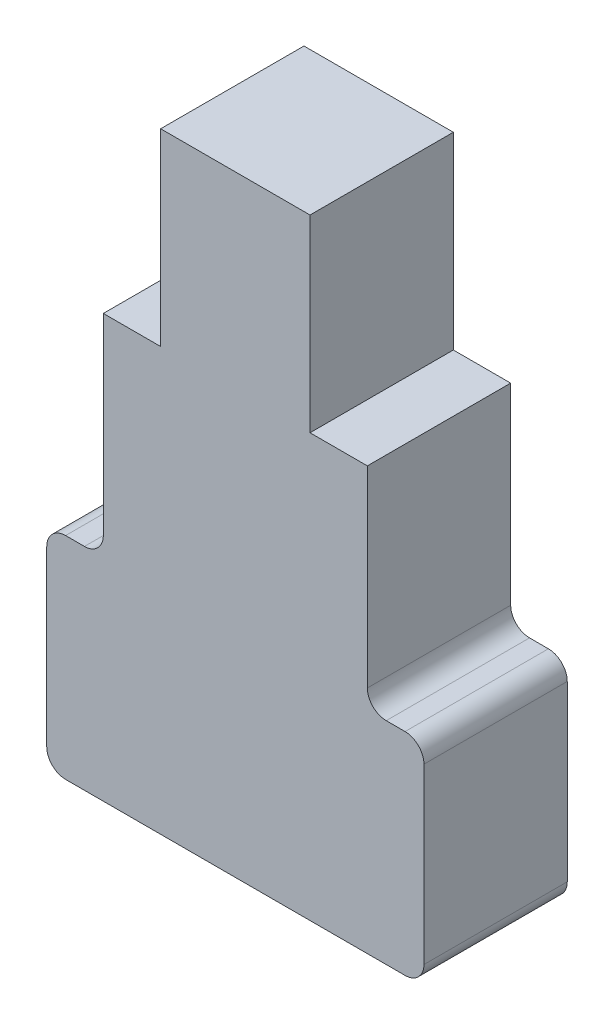
ISO-10303-21;
HEADER;
FILE_DESCRIPTION(('STEP AP214'),'2;1');
FILE_NAME('part.step','',(''),(''),'','','');
FILE_SCHEMA(('AUTOMOTIVE_DESIGN { 1 0 10303 214 1 1 1 1 }'));
ENDSEC;
DATA;
#1=APPLICATION_CONTEXT('core data for automotive mechanical design processes');
#2=APPLICATION_PROTOCOL_DEFINITION('international standard','automotive_design',2000,#1);
#3=PRODUCT_CONTEXT('',#1,'mechanical');
#4=PRODUCT('Part','Part','',(#3));
#5=PRODUCT_RELATED_PRODUCT_CATEGORY('part','',(#4));
#6=PRODUCT_DEFINITION_FORMATION('','',#4);
#7=PRODUCT_DEFINITION_CONTEXT('part definition',#1,'design');
#8=PRODUCT_DEFINITION('design','',#6,#7);
#9=PRODUCT_DEFINITION_SHAPE('','',#8);
#10=(LENGTH_UNIT() NAMED_UNIT(*) SI_UNIT(.MILLI.,.METRE.));
#11=(NAMED_UNIT(*) PLANE_ANGLE_UNIT() SI_UNIT($,.RADIAN.));
#12=(NAMED_UNIT(*) SI_UNIT($,.STERADIAN.) SOLID_ANGLE_UNIT());
#13=UNCERTAINTY_MEASURE_WITH_UNIT(LENGTH_MEASURE(1.E-05),#10,'distance_accuracy_value','');
#14=(GEOMETRIC_REPRESENTATION_CONTEXT(3) GLOBAL_UNCERTAINTY_ASSIGNED_CONTEXT((#13)) GLOBAL_UNIT_ASSIGNED_CONTEXT((#10,
#11,#12)) REPRESENTATION_CONTEXT('',''));
#15=CARTESIAN_POINT('',(0.,0.,0.));
#16=DIRECTION('',(0.,0.,1.));
#17=DIRECTION('',(1.,0.,0.));
#18=AXIS2_PLACEMENT_3D('',#15,#16,#17);
#19=CARTESIAN_POINT('',(5.02,18.48,9.59));
#20=DIRECTION('',(0.,1.,0.));
#21=DIRECTION('',(0.,0.,1.));
#22=AXIS2_PLACEMENT_3D('',#19,#20,#21);
#23=PLANE('',#22);
#24=DIRECTION('',(0.,0.,-1.));
#25=VECTOR('',#24,1.);
#26=CARTESIAN_POINT('',(5.27,18.48,9.59));
#27=LINE('',#26,#25);
#28=CARTESIAN_POINT('',(5.27,18.48,9.59));
#29=VERTEX_POINT('',#28);
#30=CARTESIAN_POINT('',(5.27,18.48,7.69));
#31=VERTEX_POINT('',#30);
#32=EDGE_CURVE('E79',#29,#31,#27,.T.);
#33=ORIENTED_EDGE('',*,*,#32,.F.);
#34=DIRECTION('',(1.,0.,0.));
#35=VECTOR('',#34,1.);
#36=CARTESIAN_POINT('',(5.02,18.48,9.59));
#37=LINE('',#36,#35);
#38=CARTESIAN_POINT('',(5.52,18.48,9.59));
#39=VERTEX_POINT('',#38);
#40=EDGE_CURVE('E75',#29,#39,#37,.T.);
#41=ORIENTED_EDGE('',*,*,#40,.T.);
#42=DIRECTION('',(0.,0.,1.));
#43=VECTOR('',#42,1.);
#44=CARTESIAN_POINT('',(5.52,18.48,9.59));
#45=LINE('',#44,#43);
#46=CARTESIAN_POINT('',(5.52,18.48,7.69));
#47=VERTEX_POINT('',#46);
#48=EDGE_CURVE('E191',#39,#47,#45,.F.);
#49=ORIENTED_EDGE('',*,*,#48,.T.);
#50=DIRECTION('',(1.,0.,0.));
#51=VECTOR('',#50,1.);
#52=CARTESIAN_POINT('',(5.02,18.48,7.69));
#53=LINE('',#52,#51);
#54=EDGE_CURVE('E236',#47,#31,#53,.F.);
#55=ORIENTED_EDGE('',*,*,#54,.T.);
#56=EDGE_LOOP('',(#33,#41,#49,#55));
#57=FACE_BOUND('',#56,.T.);
#58=ADVANCED_FACE('F16',(#57),#23,.T.);
#59=CARTESIAN_POINT('',(9.27,18.48,9.59));
#60=DIRECTION('',(0.,1.,0.));
#61=DIRECTION('',(0.,0.,1.));
#62=AXIS2_PLACEMENT_3D('',#59,#60,#61);
#63=PLANE('',#62);
#64=DIRECTION('',(0.,0.,1.));
#65=VECTOR('',#64,1.);
#66=CARTESIAN_POINT('',(9.52,18.48,9.59));
#67=LINE('',#66,#65);
#68=CARTESIAN_POINT('',(9.52,18.48,7.69));
#69=VERTEX_POINT('',#68);
#70=CARTESIAN_POINT('',(9.52,18.48,9.59));
#71=VERTEX_POINT('',#70);
#72=EDGE_CURVE('E190',#69,#71,#67,.T.);
#73=ORIENTED_EDGE('',*,*,#72,.T.);
#74=DIRECTION('',(1.,0.,0.));
#75=VECTOR('',#74,1.);
#76=CARTESIAN_POINT('',(9.27,18.48,9.59));
#77=LINE('',#76,#75);
#78=CARTESIAN_POINT('',(9.77,18.48,9.59));
#79=VERTEX_POINT('',#78);
#80=EDGE_CURVE('E80',#71,#79,#77,.T.);
#81=ORIENTED_EDGE('',*,*,#80,.T.);
#82=DIRECTION('',(0.,0.,-1.));
#83=VECTOR('',#82,1.);
#84=CARTESIAN_POINT('',(9.77,18.48,9.59));
#85=LINE('',#84,#83);
#86=CARTESIAN_POINT('',(9.77,18.48,7.69));
#87=VERTEX_POINT('',#86);
#88=EDGE_CURVE('E197',#87,#79,#85,.F.);
#89=ORIENTED_EDGE('',*,*,#88,.F.);
#90=DIRECTION('',(-1.,0.,0.));
#91=VECTOR('',#90,1.);
#92=CARTESIAN_POINT('',(7.52,18.48,7.69));
#93=LINE('',#92,#91);
#94=EDGE_CURVE('E157',#69,#87,#93,.F.);
#95=ORIENTED_EDGE('',*,*,#94,.F.);
#96=EDGE_LOOP('',(#73,#81,#89,#95));
#97=FACE_BOUND('',#96,.T.);
#98=ADVANCED_FACE('F324',(#97),#63,.T.);
#99=CARTESIAN_POINT('',(5.27,18.23,9.59));
#100=DIRECTION('',(0.,0.,-1.));
#101=DIRECTION('',(-1.,0.,0.));
#102=AXIS2_PLACEMENT_3D('',#99,#100,#101);
#103=CYLINDRICAL_SURFACE('',#102,0.25);
#104=CARTESIAN_POINT('',(5.27,18.23,9.59));
#105=DIRECTION('',(0.,0.,-1.));
#106=DIRECTION('',(-1.,0.,0.));
#107=AXIS2_PLACEMENT_3D('',#104,#105,#106);
#108=CIRCLE('',#107,0.25);
#109=CARTESIAN_POINT('',(5.02,18.23,9.59));
#110=VERTEX_POINT('',#109);
#111=EDGE_CURVE('E19',#110,#29,#108,.T.);
#112=ORIENTED_EDGE('',*,*,#111,.T.);
#113=ORIENTED_EDGE('',*,*,#32,.T.);
#114=CARTESIAN_POINT('',(5.27,18.23,7.69));
#115=DIRECTION('',(0.,0.,-1.));
#116=DIRECTION('',(-1.,0.,0.));
#117=AXIS2_PLACEMENT_3D('',#114,#115,#116);
#118=CIRCLE('',#117,0.25);
#119=CARTESIAN_POINT('',(5.02,18.23,7.69));
#120=VERTEX_POINT('',#119);
#121=EDGE_CURVE('E87',#120,#31,#118,.T.);
#122=ORIENTED_EDGE('',*,*,#121,.F.);
#123=DIRECTION('',(0.,0.,1.));
#124=VECTOR('',#123,1.);
#125=CARTESIAN_POINT('',(5.02,18.23,9.59));
#126=LINE('',#125,#124);
#127=EDGE_CURVE('E83',#110,#120,#126,.F.);
#128=ORIENTED_EDGE('',*,*,#127,.F.);
#129=EDGE_LOOP('',(#112,#113,#122,#128));
#130=FACE_BOUND('',#129,.T.);
#131=ADVANCED_FACE('F84',(#130),#103,.T.);
#132=CARTESIAN_POINT('',(5.27,15.93,9.59));
#133=DIRECTION('',(0.,0.,-1.));
#134=DIRECTION('',(-1.,0.,0.));
#135=AXIS2_PLACEMENT_3D('',#132,#133,#134);
#136=CYLINDRICAL_SURFACE('',#135,0.25);
#137=CARTESIAN_POINT('',(5.27,15.93,9.59));
#138=DIRECTION('',(0.,0.,-1.));
#139=DIRECTION('',(-1.,0.,0.));
#140=AXIS2_PLACEMENT_3D('',#137,#138,#139);
#141=CIRCLE('',#140,0.25);
#142=CARTESIAN_POINT('',(5.27,15.68,9.59));
#143=VERTEX_POINT('',#142);
#144=CARTESIAN_POINT('',(5.02,15.93,9.59));
#145=VERTEX_POINT('',#144);
#146=EDGE_CURVE('E225',#143,#145,#141,.T.);
#147=ORIENTED_EDGE('',*,*,#146,.T.);
#148=DIRECTION('',(0.,0.,1.));
#149=VECTOR('',#148,1.);
#150=CARTESIAN_POINT('',(5.02,15.93,9.59));
#151=LINE('',#150,#149);
#152=CARTESIAN_POINT('',(5.02,15.93,7.69));
#153=VERTEX_POINT('',#152);
#154=EDGE_CURVE('E97',#153,#145,#151,.T.);
#155=ORIENTED_EDGE('',*,*,#154,.F.);
#156=CARTESIAN_POINT('',(5.27,15.93,7.69));
#157=DIRECTION('',(0.,0.,-1.));
#158=DIRECTION('',(-1.,0.,0.));
#159=AXIS2_PLACEMENT_3D('',#156,#157,#158);
#160=CIRCLE('',#159,0.25);
#161=CARTESIAN_POINT('',(5.27,15.68,7.69));
#162=VERTEX_POINT('',#161);
#163=EDGE_CURVE('E250',#162,#153,#160,.T.);
#164=ORIENTED_EDGE('',*,*,#163,.F.);
#165=DIRECTION('',(0.,0.,-1.));
#166=VECTOR('',#165,1.);
#167=CARTESIAN_POINT('',(5.27,15.68,9.59));
#168=LINE('',#167,#166);
#169=EDGE_CURVE('E151',#143,#162,#168,.T.);
#170=ORIENTED_EDGE('',*,*,#169,.F.);
#171=EDGE_LOOP('',(#147,#155,#164,#170));
#172=FACE_BOUND('',#171,.T.);
#173=ADVANCED_FACE('F257',(#172),#136,.T.);
#174=CARTESIAN_POINT('',(5.52,18.73,9.59));
#175=DIRECTION('',(0.,0.,1.));
#176=DIRECTION('',(1.,0.,0.));
#177=AXIS2_PLACEMENT_3D('',#174,#175,#176);
#178=CYLINDRICAL_SURFACE('',#177,0.25);
#179=ORIENTED_EDGE('',*,*,#48,.F.);
#180=CARTESIAN_POINT('',(5.52,18.73,9.59));
#181=DIRECTION('',(0.,0.,1.));
#182=DIRECTION('',(1.,0.,0.));
#183=AXIS2_PLACEMENT_3D('',#180,#181,#182);
#184=CIRCLE('',#183,0.25);
#185=CARTESIAN_POINT('',(5.77,18.73,9.59));
#186=VERTEX_POINT('',#185);
#187=EDGE_CURVE('E223',#186,#39,#184,.F.);
#188=ORIENTED_EDGE('',*,*,#187,.F.);
#189=DIRECTION('',(0.,0.,1.));
#190=VECTOR('',#189,1.);
#191=CARTESIAN_POINT('',(5.77,18.73,9.59));
#192=LINE('',#191,#190);
#193=CARTESIAN_POINT('',(5.77,18.73,7.69));
#194=VERTEX_POINT('',#193);
#195=EDGE_CURVE('E137',#194,#186,#192,.T.);
#196=ORIENTED_EDGE('',*,*,#195,.F.);
#197=CARTESIAN_POINT('',(5.52,18.73,7.69));
#198=DIRECTION('',(0.,0.,1.));
#199=DIRECTION('',(1.,0.,0.));
#200=AXIS2_PLACEMENT_3D('',#197,#198,#199);
#201=CIRCLE('',#200,0.25);
#202=EDGE_CURVE('E184',#47,#194,#201,.T.);
#203=ORIENTED_EDGE('',*,*,#202,.F.);
#204=EDGE_LOOP('',(#179,#188,#196,#203));
#205=FACE_BOUND('',#204,.T.);
#206=ADVANCED_FACE('F404',(#205),#178,.F.);
#207=CARTESIAN_POINT('',(5.77,21.28,9.59));
#208=DIRECTION('',(0.,1.,0.));
#209=DIRECTION('',(0.,0.,1.));
#210=AXIS2_PLACEMENT_3D('',#207,#208,#209);
#211=PLANE('',#210);
#212=DIRECTION('',(0.,0.,1.));
#213=VECTOR('',#212,1.);
#214=CARTESIAN_POINT('',(5.77,21.28,9.59));
#215=LINE('',#214,#213);
#216=CARTESIAN_POINT('',(5.77,21.28,9.59));
#217=VERTEX_POINT('',#216);
#218=CARTESIAN_POINT('',(5.77,21.28,7.69));
#219=VERTEX_POINT('',#218);
#220=EDGE_CURVE('E142',#217,#219,#215,.F.);
#221=ORIENTED_EDGE('',*,*,#220,.F.);
#222=DIRECTION('',(1.,0.,0.));
#223=VECTOR('',#222,1.);
#224=CARTESIAN_POINT('',(5.77,21.28,9.59));
#225=LINE('',#224,#223);
#226=CARTESIAN_POINT('',(6.53,21.28,9.59));
#227=VERTEX_POINT('',#226);
#228=EDGE_CURVE('E187',#217,#227,#225,.T.);
#229=ORIENTED_EDGE('',*,*,#228,.T.);
#230=DIRECTION('',(0.,0.,1.));
#231=VECTOR('',#230,1.);
#232=CARTESIAN_POINT('',(6.53,21.28,9.59));
#233=LINE('',#232,#231);
#234=CARTESIAN_POINT('',(6.53,21.28,7.69));
#235=VERTEX_POINT('',#234);
#236=EDGE_CURVE('E136',#235,#227,#233,.T.);
#237=ORIENTED_EDGE('',*,*,#236,.F.);
#238=DIRECTION('',(-1.,0.,0.));
#239=VECTOR('',#238,1.);
#240=CARTESIAN_POINT('',(7.52,21.28,7.69));
#241=LINE('',#240,#239);
#242=EDGE_CURVE('E175',#219,#235,#241,.F.);
#243=ORIENTED_EDGE('',*,*,#242,.F.);
#244=EDGE_LOOP('',(#221,#229,#237,#243));
#245=FACE_BOUND('',#244,.T.);
#246=ADVANCED_FACE('F354',(#245),#211,.T.);
#247=CARTESIAN_POINT('',(9.52,18.73,9.59));
#248=DIRECTION('',(0.,0.,1.));
#249=DIRECTION('',(1.,0.,0.));
#250=AXIS2_PLACEMENT_3D('',#247,#248,#249);
#251=CYLINDRICAL_SURFACE('',#250,0.25);
#252=DIRECTION('',(0.,0.,-1.));
#253=VECTOR('',#252,1.);
#254=CARTESIAN_POINT('',(9.27,18.73,9.59));
#255=LINE('',#254,#253);
#256=CARTESIAN_POINT('',(9.27,18.73,9.59));
#257=VERTEX_POINT('',#256);
#258=CARTESIAN_POINT('',(9.27,18.73,7.69));
#259=VERTEX_POINT('',#258);
#260=EDGE_CURVE('E117',#257,#259,#255,.T.);
#261=ORIENTED_EDGE('',*,*,#260,.F.);
#262=CARTESIAN_POINT('',(9.52,18.73,9.59));
#263=DIRECTION('',(0.,0.,1.));
#264=DIRECTION('',(1.,0.,0.));
#265=AXIS2_PLACEMENT_3D('',#262,#263,#264);
#266=CIRCLE('',#265,0.25);
#267=EDGE_CURVE('E165',#71,#257,#266,.F.);
#268=ORIENTED_EDGE('',*,*,#267,.F.);
#269=ORIENTED_EDGE('',*,*,#72,.F.);
#270=CARTESIAN_POINT('',(9.52,18.73,7.69));
#271=DIRECTION('',(0.,0.,1.));
#272=DIRECTION('',(1.,0.,0.));
#273=AXIS2_PLACEMENT_3D('',#270,#271,#272);
#274=CIRCLE('',#273,0.25);
#275=EDGE_CURVE('E161',#259,#69,#274,.T.);
#276=ORIENTED_EDGE('',*,*,#275,.F.);
#277=EDGE_LOOP('',(#261,#268,#269,#276));
#278=FACE_BOUND('',#277,.T.);
#279=ADVANCED_FACE('F329',(#278),#251,.F.);
#280=CARTESIAN_POINT('',(8.51,21.28,9.59));
#281=DIRECTION('',(0.,1.,0.));
#282=DIRECTION('',(0.,0.,1.));
#283=AXIS2_PLACEMENT_3D('',#280,#281,#282);
#284=PLANE('',#283);
#285=DIRECTION('',(0.,0.,-1.));
#286=VECTOR('',#285,1.);
#287=CARTESIAN_POINT('',(8.51,21.28,9.59));
#288=LINE('',#287,#286);
#289=CARTESIAN_POINT('',(8.51,21.28,9.59));
#290=VERTEX_POINT('',#289);
#291=CARTESIAN_POINT('',(8.51,21.28,7.69));
#292=VERTEX_POINT('',#291);
#293=EDGE_CURVE('E132',#290,#292,#288,.T.);
#294=ORIENTED_EDGE('',*,*,#293,.F.);
#295=DIRECTION('',(1.,0.,0.));
#296=VECTOR('',#295,1.);
#297=CARTESIAN_POINT('',(8.51,21.28,9.59));
#298=LINE('',#297,#296);
#299=CARTESIAN_POINT('',(9.27,21.28,9.59));
#300=VERTEX_POINT('',#299);
#301=EDGE_CURVE('E162',#290,#300,#298,.T.);
#302=ORIENTED_EDGE('',*,*,#301,.T.);
#303=DIRECTION('',(0.,0.,-1.));
#304=VECTOR('',#303,1.);
#305=CARTESIAN_POINT('',(9.27,21.28,9.59));
#306=LINE('',#305,#304);
#307=CARTESIAN_POINT('',(9.27,21.28,7.69));
#308=VERTEX_POINT('',#307);
#309=EDGE_CURVE('E116',#308,#300,#306,.F.);
#310=ORIENTED_EDGE('',*,*,#309,.F.);
#311=DIRECTION('',(-1.,0.,0.));
#312=VECTOR('',#311,1.);
#313=CARTESIAN_POINT('',(7.52,21.28,7.69));
#314=LINE('',#313,#312);
#315=EDGE_CURVE('E172',#292,#308,#314,.F.);
#316=ORIENTED_EDGE('',*,*,#315,.F.);
#317=EDGE_LOOP('',(#294,#302,#310,#316));
#318=FACE_BOUND('',#317,.T.);
#319=ADVANCED_FACE('F396',(#318),#284,.T.);
#320=CARTESIAN_POINT('',(9.77,15.93,9.59));
#321=DIRECTION('',(0.,0.,-1.));
#322=DIRECTION('',(-1.,0.,0.));
#323=AXIS2_PLACEMENT_3D('',#320,#321,#322);
#324=CYLINDRICAL_SURFACE('',#323,0.25);
#325=CARTESIAN_POINT('',(9.77,15.93,9.59));
#326=DIRECTION('',(0.,0.,-1.));
#327=DIRECTION('',(-1.,0.,0.));
#328=AXIS2_PLACEMENT_3D('',#325,#326,#327);
#329=CIRCLE('',#328,0.25);
#330=CARTESIAN_POINT('',(10.02,15.93,9.59));
#331=VERTEX_POINT('',#330);
#332=CARTESIAN_POINT('',(9.77,15.68,9.59));
#333=VERTEX_POINT('',#332);
#334=EDGE_CURVE('E34',#331,#333,#329,.T.);
#335=ORIENTED_EDGE('',*,*,#334,.T.);
#336=DIRECTION('',(0.,0.,-1.));
#337=VECTOR('',#336,1.);
#338=CARTESIAN_POINT('',(9.77,15.68,9.59));
#339=LINE('',#338,#337);
#340=CARTESIAN_POINT('',(9.77,15.68,7.69));
#341=VERTEX_POINT('',#340);
#342=EDGE_CURVE('E92',#341,#333,#339,.F.);
#343=ORIENTED_EDGE('',*,*,#342,.F.);
#344=CARTESIAN_POINT('',(9.77,15.93,7.69));
#345=DIRECTION('',(0.,0.,-1.));
#346=DIRECTION('',(-1.,0.,0.));
#347=AXIS2_PLACEMENT_3D('',#344,#345,#346);
#348=CIRCLE('',#347,0.25);
#349=CARTESIAN_POINT('',(10.02,15.93,7.69));
#350=VERTEX_POINT('',#349);
#351=EDGE_CURVE('E160',#350,#341,#348,.T.);
#352=ORIENTED_EDGE('',*,*,#351,.F.);
#353=DIRECTION('',(0.,0.,-1.));
#354=VECTOR('',#353,1.);
#355=CARTESIAN_POINT('',(10.02,15.93,9.59));
#356=LINE('',#355,#354);
#357=EDGE_CURVE('E113',#331,#350,#356,.T.);
#358=ORIENTED_EDGE('',*,*,#357,.F.);
#359=EDGE_LOOP('',(#335,#343,#352,#358));
#360=FACE_BOUND('',#359,.T.);
#361=ADVANCED_FACE('F267',(#360),#324,.T.);
#362=CARTESIAN_POINT('',(7.52,15.68,7.69));
#363=DIRECTION('',(0.,0.,-1.));
#364=DIRECTION('',(-1.,0.,0.));
#365=AXIS2_PLACEMENT_3D('',#362,#363,#364);
#366=PLANE('',#365);
#367=ORIENTED_EDGE('',*,*,#351,.T.);
#368=DIRECTION('',(1.,0.,0.));
#369=VECTOR('',#368,1.);
#370=CARTESIAN_POINT('',(10.02,15.68,7.69));
#371=LINE('',#370,#369);
#372=EDGE_CURVE('E150',#162,#341,#371,.T.);
#373=ORIENTED_EDGE('',*,*,#372,.F.);
#374=ORIENTED_EDGE('',*,*,#163,.T.);
#375=DIRECTION('',(0.,1.,0.));
#376=VECTOR('',#375,1.);
#377=CARTESIAN_POINT('',(5.02,15.68,7.69));
#378=LINE('',#377,#376);
#379=EDGE_CURVE('E91',#120,#153,#378,.F.);
#380=ORIENTED_EDGE('',*,*,#379,.F.);
#381=ORIENTED_EDGE('',*,*,#121,.T.);
#382=ORIENTED_EDGE('',*,*,#54,.F.);
#383=ORIENTED_EDGE('',*,*,#202,.T.);
#384=DIRECTION('',(0.,1.,0.));
#385=VECTOR('',#384,1.);
#386=CARTESIAN_POINT('',(5.77,18.48,7.69));
#387=LINE('',#386,#385);
#388=EDGE_CURVE('E141',#219,#194,#387,.F.);
#389=ORIENTED_EDGE('',*,*,#388,.F.);
#390=ORIENTED_EDGE('',*,*,#242,.T.);
#391=DIRECTION('',(0.,1.,0.));
#392=VECTOR('',#391,1.);
#393=CARTESIAN_POINT('',(6.53,21.28,7.69));
#394=LINE('',#393,#392);
#395=CARTESIAN_POINT('',(6.53,23.78,7.69));
#396=VERTEX_POINT('',#395);
#397=EDGE_CURVE('E140',#396,#235,#394,.F.);
#398=ORIENTED_EDGE('',*,*,#397,.F.);
#399=DIRECTION('',(1.,0.,0.));
#400=VECTOR('',#399,1.);
#401=CARTESIAN_POINT('',(6.53,23.78,7.69));
#402=LINE('',#401,#400);
#403=CARTESIAN_POINT('',(8.51,23.78,7.69));
#404=VERTEX_POINT('',#403);
#405=EDGE_CURVE('E133',#404,#396,#402,.F.);
#406=ORIENTED_EDGE('',*,*,#405,.F.);
#407=DIRECTION('',(0.,1.,0.));
#408=VECTOR('',#407,1.);
#409=CARTESIAN_POINT('',(8.51,23.78,7.69));
#410=LINE('',#409,#408);
#411=EDGE_CURVE('E128',#292,#404,#410,.T.);
#412=ORIENTED_EDGE('',*,*,#411,.F.);
#413=ORIENTED_EDGE('',*,*,#315,.T.);
#414=DIRECTION('',(0.,1.,0.));
#415=VECTOR('',#414,1.);
#416=CARTESIAN_POINT('',(9.27,21.28,7.69));
#417=LINE('',#416,#415);
#418=EDGE_CURVE('E120',#259,#308,#417,.T.);
#419=ORIENTED_EDGE('',*,*,#418,.F.);
#420=ORIENTED_EDGE('',*,*,#275,.T.);
#421=ORIENTED_EDGE('',*,*,#94,.T.);
#422=CARTESIAN_POINT('',(9.77,18.23,7.69));
#423=DIRECTION('',(0.,0.,-1.));
#424=DIRECTION('',(-1.,0.,0.));
#425=AXIS2_PLACEMENT_3D('',#422,#423,#424);
#426=CIRCLE('',#425,0.25);
#427=CARTESIAN_POINT('',(10.02,18.23,7.69));
#428=VERTEX_POINT('',#427);
#429=EDGE_CURVE('E200',#428,#87,#426,.F.);
#430=ORIENTED_EDGE('',*,*,#429,.F.);
#431=DIRECTION('',(0.,1.,0.));
#432=VECTOR('',#431,1.);
#433=CARTESIAN_POINT('',(10.02,18.48,7.69));
#434=LINE('',#433,#432);
#435=EDGE_CURVE('E112',#350,#428,#434,.T.);
#436=ORIENTED_EDGE('',*,*,#435,.F.);
#437=EDGE_LOOP('',(#367,#373,#374,#380,#381,#382,#383,#389,#390,#398,#406,#412,#413,#419,#420,
#421,#430,#436));
#438=FACE_BOUND('',#437,.T.);
#439=ADVANCED_FACE('F295',(#438),#366,.T.);
#440=CARTESIAN_POINT('',(9.77,18.23,9.59));
#441=DIRECTION('',(0.,0.,-1.));
#442=DIRECTION('',(-1.,0.,0.));
#443=AXIS2_PLACEMENT_3D('',#440,#441,#442);
#444=CYLINDRICAL_SURFACE('',#443,0.25);
#445=CARTESIAN_POINT('',(9.77,18.23,9.59));
#446=DIRECTION('',(0.,0.,-1.));
#447=DIRECTION('',(-1.,0.,0.));
#448=AXIS2_PLACEMENT_3D('',#445,#446,#447);
#449=CIRCLE('',#448,0.25);
#450=CARTESIAN_POINT('',(10.02,18.23,9.59));
#451=VERTEX_POINT('',#450);
#452=EDGE_CURVE('E154',#79,#451,#449,.T.);
#453=ORIENTED_EDGE('',*,*,#452,.T.);
#454=DIRECTION('',(0.,0.,-1.));
#455=VECTOR('',#454,1.);
#456=CARTESIAN_POINT('',(10.02,18.23,9.59));
#457=LINE('',#456,#455);
#458=EDGE_CURVE('E105',#428,#451,#457,.F.);
#459=ORIENTED_EDGE('',*,*,#458,.F.);
#460=ORIENTED_EDGE('',*,*,#429,.T.);
#461=ORIENTED_EDGE('',*,*,#88,.T.);
#462=EDGE_LOOP('',(#453,#459,#460,#461));
#463=FACE_BOUND('',#462,.T.);
#464=ADVANCED_FACE('F322',(#463),#444,.T.);
#465=CARTESIAN_POINT('',(10.02,15.68,9.59));
#466=DIRECTION('',(0.,-1.,0.));
#467=DIRECTION('',(0.,0.,-1.));
#468=AXIS2_PLACEMENT_3D('',#465,#466,#467);
#469=PLANE('',#468);
#470=ORIENTED_EDGE('',*,*,#342,.T.);
#471=DIRECTION('',(-1.,0.,0.));
#472=VECTOR('',#471,1.);
#473=CARTESIAN_POINT('',(7.52,15.68,9.59));
#474=LINE('',#473,#472);
#475=EDGE_CURVE('E99',#333,#143,#474,.T.);
#476=ORIENTED_EDGE('',*,*,#475,.T.);
#477=ORIENTED_EDGE('',*,*,#169,.T.);
#478=ORIENTED_EDGE('',*,*,#372,.T.);
#479=EDGE_LOOP('',(#470,#476,#477,#478));
#480=FACE_BOUND('',#479,.T.);
#481=ADVANCED_FACE('F260',(#480),#469,.T.);
#482=CARTESIAN_POINT('',(5.02,15.68,9.59));
#483=DIRECTION('',(-1.,0.,0.));
#484=DIRECTION('',(0.,0.,1.));
#485=AXIS2_PLACEMENT_3D('',#482,#483,#484);
#486=PLANE('',#485);
#487=ORIENTED_EDGE('',*,*,#154,.T.);
#488=DIRECTION('',(0.,1.,0.));
#489=VECTOR('',#488,1.);
#490=CARTESIAN_POINT('',(5.02,15.68,9.59));
#491=LINE('',#490,#489);
#492=EDGE_CURVE('E73',#145,#110,#491,.T.);
#493=ORIENTED_EDGE('',*,*,#492,.T.);
#494=ORIENTED_EDGE('',*,*,#127,.T.);
#495=ORIENTED_EDGE('',*,*,#379,.T.);
#496=EDGE_LOOP('',(#487,#493,#494,#495));
#497=FACE_BOUND('',#496,.T.);
#498=ADVANCED_FACE('F95',(#497),#486,.T.);
#499=CARTESIAN_POINT('',(5.77,18.48,9.59));
#500=DIRECTION('',(-1.,0.,0.));
#501=DIRECTION('',(0.,0.,1.));
#502=AXIS2_PLACEMENT_3D('',#499,#500,#501);
#503=PLANE('',#502);
#504=ORIENTED_EDGE('',*,*,#195,.T.);
#505=DIRECTION('',(0.,1.,0.));
#506=VECTOR('',#505,1.);
#507=CARTESIAN_POINT('',(5.77,15.68,9.59));
#508=LINE('',#507,#506);
#509=EDGE_CURVE('E98',#186,#217,#508,.T.);
#510=ORIENTED_EDGE('',*,*,#509,.T.);
#511=ORIENTED_EDGE('',*,*,#220,.T.);
#512=ORIENTED_EDGE('',*,*,#388,.T.);
#513=EDGE_LOOP('',(#504,#510,#511,#512));
#514=FACE_BOUND('',#513,.T.);
#515=ADVANCED_FACE('F383',(#514),#503,.T.);
#516=CARTESIAN_POINT('',(6.53,21.28,9.59));
#517=DIRECTION('',(-1.,0.,0.));
#518=DIRECTION('',(0.,0.,1.));
#519=AXIS2_PLACEMENT_3D('',#516,#517,#518);
#520=PLANE('',#519);
#521=ORIENTED_EDGE('',*,*,#236,.T.);
#522=DIRECTION('',(0.,1.,0.));
#523=VECTOR('',#522,1.);
#524=CARTESIAN_POINT('',(6.53,15.68,9.59));
#525=LINE('',#524,#523);
#526=CARTESIAN_POINT('',(6.53,23.78,9.59));
#527=VERTEX_POINT('',#526);
#528=EDGE_CURVE('E102',#227,#527,#525,.T.);
#529=ORIENTED_EDGE('',*,*,#528,.T.);
#530=DIRECTION('',(0.,0.,1.));
#531=VECTOR('',#530,1.);
#532=CARTESIAN_POINT('',(6.53,23.78,9.59));
#533=LINE('',#532,#531);
#534=EDGE_CURVE('E129',#396,#527,#533,.T.);
#535=ORIENTED_EDGE('',*,*,#534,.F.);
#536=ORIENTED_EDGE('',*,*,#397,.T.);
#537=EDGE_LOOP('',(#521,#529,#535,#536));
#538=FACE_BOUND('',#537,.T.);
#539=ADVANCED_FACE('F349',(#538),#520,.T.);
#540=CARTESIAN_POINT('',(6.53,23.78,9.59));
#541=DIRECTION('',(0.,1.,0.));
#542=DIRECTION('',(0.,0.,1.));
#543=AXIS2_PLACEMENT_3D('',#540,#541,#542);
#544=PLANE('',#543);
#545=ORIENTED_EDGE('',*,*,#534,.T.);
#546=DIRECTION('',(-1.,0.,0.));
#547=VECTOR('',#546,1.);
#548=CARTESIAN_POINT('',(7.52,23.78,9.59));
#549=LINE('',#548,#547);
#550=CARTESIAN_POINT('',(8.51,23.78,9.59));
#551=VERTEX_POINT('',#550);
#552=EDGE_CURVE('E229',#527,#551,#549,.F.);
#553=ORIENTED_EDGE('',*,*,#552,.T.);
#554=DIRECTION('',(0.,0.,-1.));
#555=VECTOR('',#554,1.);
#556=CARTESIAN_POINT('',(8.51,23.78,9.59));
#557=LINE('',#556,#555);
#558=EDGE_CURVE('E121',#404,#551,#557,.F.);
#559=ORIENTED_EDGE('',*,*,#558,.F.);
#560=ORIENTED_EDGE('',*,*,#405,.T.);
#561=EDGE_LOOP('',(#545,#553,#559,#560));
#562=FACE_BOUND('',#561,.T.);
#563=ADVANCED_FACE('F342',(#562),#544,.T.);
#564=CARTESIAN_POINT('',(8.51,23.78,9.59));
#565=DIRECTION('',(1.,0.,0.));
#566=DIRECTION('',(0.,0.,-1.));
#567=AXIS2_PLACEMENT_3D('',#564,#565,#566);
#568=PLANE('',#567);
#569=ORIENTED_EDGE('',*,*,#558,.T.);
#570=DIRECTION('',(0.,1.,0.));
#571=VECTOR('',#570,1.);
#572=CARTESIAN_POINT('',(8.51,15.68,9.59));
#573=LINE('',#572,#571);
#574=EDGE_CURVE('E226',#551,#290,#573,.F.);
#575=ORIENTED_EDGE('',*,*,#574,.T.);
#576=ORIENTED_EDGE('',*,*,#293,.T.);
#577=ORIENTED_EDGE('',*,*,#411,.T.);
#578=EDGE_LOOP('',(#569,#575,#576,#577));
#579=FACE_BOUND('',#578,.T.);
#580=ADVANCED_FACE('F373',(#579),#568,.T.);
#581=CARTESIAN_POINT('',(9.27,21.28,9.59));
#582=DIRECTION('',(1.,0.,0.));
#583=DIRECTION('',(0.,0.,-1.));
#584=AXIS2_PLACEMENT_3D('',#581,#582,#583);
#585=PLANE('',#584);
#586=ORIENTED_EDGE('',*,*,#309,.T.);
#587=DIRECTION('',(0.,1.,0.));
#588=VECTOR('',#587,1.);
#589=CARTESIAN_POINT('',(9.27,15.68,9.59));
#590=LINE('',#589,#588);
#591=EDGE_CURVE('E25',#300,#257,#590,.F.);
#592=ORIENTED_EDGE('',*,*,#591,.T.);
#593=ORIENTED_EDGE('',*,*,#260,.T.);
#594=ORIENTED_EDGE('',*,*,#418,.T.);
#595=EDGE_LOOP('',(#586,#592,#593,#594));
#596=FACE_BOUND('',#595,.T.);
#597=ADVANCED_FACE('F332',(#596),#585,.T.);
#598=CARTESIAN_POINT('',(10.02,18.48,9.59));
#599=DIRECTION('',(1.,0.,0.));
#600=DIRECTION('',(0.,0.,-1.));
#601=AXIS2_PLACEMENT_3D('',#598,#599,#600);
#602=PLANE('',#601);
#603=ORIENTED_EDGE('',*,*,#458,.T.);
#604=DIRECTION('',(0.,1.,0.));
#605=VECTOR('',#604,1.);
#606=CARTESIAN_POINT('',(10.02,15.68,9.59));
#607=LINE('',#606,#605);
#608=EDGE_CURVE('E11',#451,#331,#607,.F.);
#609=ORIENTED_EDGE('',*,*,#608,.T.);
#610=ORIENTED_EDGE('',*,*,#357,.T.);
#611=ORIENTED_EDGE('',*,*,#435,.T.);
#612=EDGE_LOOP('',(#603,#609,#610,#611));
#613=FACE_BOUND('',#612,.T.);
#614=ADVANCED_FACE('F364',(#613),#602,.T.);
#615=CARTESIAN_POINT('',(7.52,15.68,9.59));
#616=DIRECTION('',(0.,0.,-1.));
#617=DIRECTION('',(-1.,0.,0.));
#618=AXIS2_PLACEMENT_3D('',#615,#616,#617);
#619=PLANE('',#618);
#620=ORIENTED_EDGE('',*,*,#608,.F.);
#621=ORIENTED_EDGE('',*,*,#452,.F.);
#622=ORIENTED_EDGE('',*,*,#80,.F.);
#623=ORIENTED_EDGE('',*,*,#267,.T.);
#624=ORIENTED_EDGE('',*,*,#591,.F.);
#625=ORIENTED_EDGE('',*,*,#301,.F.);
#626=ORIENTED_EDGE('',*,*,#574,.F.);
#627=ORIENTED_EDGE('',*,*,#552,.F.);
#628=ORIENTED_EDGE('',*,*,#528,.F.);
#629=ORIENTED_EDGE('',*,*,#228,.F.);
#630=ORIENTED_EDGE('',*,*,#509,.F.);
#631=ORIENTED_EDGE('',*,*,#187,.T.);
#632=ORIENTED_EDGE('',*,*,#40,.F.);
#633=ORIENTED_EDGE('',*,*,#111,.F.);
#634=ORIENTED_EDGE('',*,*,#492,.F.);
#635=ORIENTED_EDGE('',*,*,#146,.F.);
#636=ORIENTED_EDGE('',*,*,#475,.F.);
#637=ORIENTED_EDGE('',*,*,#334,.F.);
#638=EDGE_LOOP('',(#620,#621,#622,#623,#624,#625,#626,#627,#628,#629,#630,#631,#632,#633,#634,
#635,#636,#637));
#639=FACE_BOUND('',#638,.T.);
#640=ADVANCED_FACE('F71',(#639),#619,.F.);
#641=CLOSED_SHELL('',(#58,#98,#131,#173,#206,#246,#279,#319,#361,#439,#464,#481,#498,#515,#539,
#563,#580,#597,#614,#640));
#642=MANIFOLD_SOLID_BREP('B1',#641);
#643=ADVANCED_BREP_SHAPE_REPRESENTATION('',(#18,#642),#14);
#644=SHAPE_DEFINITION_REPRESENTATION(#9,#643);
ENDSEC;
END-ISO-10303-21;
